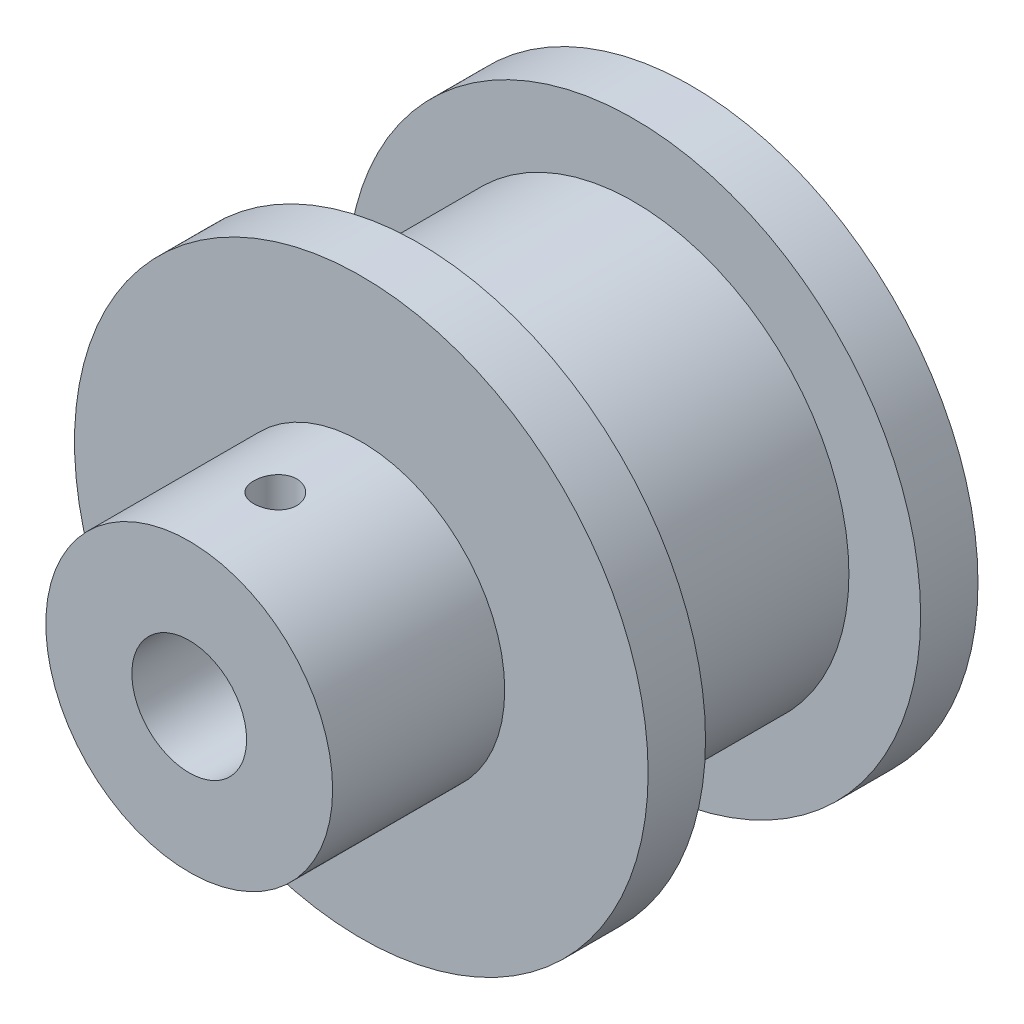
ISO-10303-21;
HEADER;
FILE_DESCRIPTION(('STEP AP214'),'2;1');
FILE_NAME('part.step','',(''),(''),'','','');
FILE_SCHEMA(('AUTOMOTIVE_DESIGN { 1 0 10303 214 1 1 1 1 }'));
ENDSEC;
DATA;
#1=APPLICATION_CONTEXT('core data for automotive mechanical design processes');
#2=APPLICATION_PROTOCOL_DEFINITION('international standard','automotive_design',2000,#1);
#3=PRODUCT_CONTEXT('',#1,'mechanical');
#4=PRODUCT('Part','Part','',(#3));
#5=PRODUCT_RELATED_PRODUCT_CATEGORY('part','',(#4));
#6=PRODUCT_DEFINITION_FORMATION('','',#4);
#7=PRODUCT_DEFINITION_CONTEXT('part definition',#1,'design');
#8=PRODUCT_DEFINITION('design','',#6,#7);
#9=PRODUCT_DEFINITION_SHAPE('','',#8);
#10=(LENGTH_UNIT() NAMED_UNIT(*) SI_UNIT(.MILLI.,.METRE.));
#11=(NAMED_UNIT(*) PLANE_ANGLE_UNIT() SI_UNIT($,.RADIAN.));
#12=(NAMED_UNIT(*) SI_UNIT($,.STERADIAN.) SOLID_ANGLE_UNIT());
#13=UNCERTAINTY_MEASURE_WITH_UNIT(LENGTH_MEASURE(1.E-05),#10,'distance_accuracy_value','');
#14=(GEOMETRIC_REPRESENTATION_CONTEXT(3) GLOBAL_UNCERTAINTY_ASSIGNED_CONTEXT((#13)) GLOBAL_UNIT_ASSIGNED_CONTEXT((#10,
#11,#12)) REPRESENTATION_CONTEXT('',''));
#15=CARTESIAN_POINT('',(0.,0.,0.));
#16=DIRECTION('',(0.,0.,1.));
#17=DIRECTION('',(1.,0.,0.));
#18=AXIS2_PLACEMENT_3D('',#15,#16,#17);
#19=CARTESIAN_POINT('',(0.,0.,31.));
#20=DIRECTION('',(0.,0.,-1.));
#21=DIRECTION('',(-1.,0.,0.));
#22=AXIS2_PLACEMENT_3D('',#19,#20,#21);
#23=CYLINDRICAL_SURFACE('',#22,4.);
#24=CARTESIAN_POINT('',(0.,0.,31.));
#25=DIRECTION('',(0.,0.,1.));
#26=DIRECTION('',(1.,0.,0.));
#27=AXIS2_PLACEMENT_3D('',#24,#25,#26);
#28=CIRCLE('',#27,4.);
#29=CARTESIAN_POINT('',(4.,0.,31.));
#30=VERTEX_POINT('',#29);
#31=EDGE_CURVE('E87',#30,#30,#28,.T.);
#32=ORIENTED_EDGE('',*,*,#31,.T.);
#33=EDGE_LOOP('',(#32));
#34=FACE_BOUND('',#33,.T.);
#35=CARTESIAN_POINT('',(0.,4.,23.5));
#36=CARTESIAN_POINT('',(-0.0812350589378528,4.00000217456151,23.4999970976969));
#37=CARTESIAN_POINT('',(-0.162450241781792,3.99750379283184,23.5066197602484));
#38=CARTESIAN_POINT('',(-0.322453452352361,3.98778696006928,23.5328281952699));
#39=CARTESIAN_POINT('',(-0.401241827987616,3.98056918893993,23.5524121004706));
#40=CARTESIAN_POINT('',(-0.554060784990879,3.96218832391545,23.6037530017718));
#41=CARTESIAN_POINT('',(-0.628100224162278,3.9510328434944,23.6354865168218));
#42=CARTESIAN_POINT('',(-0.769799310160254,3.92588767765353,23.7101064130158));
#43=CARTESIAN_POINT('',(-0.83745723917788,3.91189723227548,23.7529957855442));
#44=CARTESIAN_POINT('',(-0.967346417045826,3.88186246971217,23.8506125310709));
#45=CARTESIAN_POINT('',(-1.02927073015119,3.86576002583566,23.9057302622594));
#46=CARTESIAN_POINT('',(-1.14324421474363,3.83360220871327,24.0254104346588));
#47=CARTESIAN_POINT('',(-1.19529036359203,3.81754685135033,24.0899757560879));
#48=CARTESIAN_POINT('',(-1.28998202215985,3.78662470617731,24.2297174675232));
#49=CARTESIAN_POINT('',(-1.3321939319576,3.77182648820818,24.3052043665458));
#50=CARTESIAN_POINT('',(-1.40318646334084,3.74599860237433,24.4628483541685));
#51=CARTESIAN_POINT('',(-1.43197244961239,3.73496742975881,24.5450027631551));
#52=CARTESIAN_POINT('',(-1.47408431017549,3.71854412824136,24.7101167402582));
#53=CARTESIAN_POINT('',(-1.48799593218558,3.71293924350838,24.7929050384354));
#54=CARTESIAN_POINT('',(-1.50179556531648,3.70738061461215,24.9598161579938));
#55=CARTESIAN_POINT('',(-1.50168936802631,3.70742453659305,25.0439384138745));
#56=CARTESIAN_POINT('',(-1.48790429610018,3.71297511632055,25.205769525213));
#57=CARTESIAN_POINT('',(-1.47503808509003,3.71815468871122,25.2835609060442));
#58=CARTESIAN_POINT('',(-1.4374416786833,3.7328493805953,25.4357871504053));
#59=CARTESIAN_POINT('',(-1.41270969663258,3.74236515298863,25.5102215066139));
#60=CARTESIAN_POINT('',(-1.35163748571904,3.76485702190253,25.6552770677282));
#61=CARTESIAN_POINT('',(-1.31508648737101,3.77789517988166,25.7257994861213));
#62=CARTESIAN_POINT('',(-1.23156073762698,3.80594210139319,25.859945737591));
#63=CARTESIAN_POINT('',(-1.18458238728897,3.82095154457158,25.9235671775197));
#64=CARTESIAN_POINT('',(-1.07781780766549,3.85248038859113,26.0466036636509));
#65=CARTESIAN_POINT('',(-1.01738298716956,3.86903347455671,26.1054486407481));
#66=CARTESIAN_POINT('',(-0.887312590819022,3.90091728164085,26.2123379662058));
#67=CARTESIAN_POINT('',(-0.817675603497365,3.91624781465952,26.2603806546057));
#68=CARTESIAN_POINT('',(-0.669723436992419,3.9442639480908,26.3449303970625));
#69=CARTESIAN_POINT('',(-0.591290713844718,3.95690498259616,26.3812475812211));
#70=CARTESIAN_POINT('',(-0.428836850524582,3.97778718326962,26.43998260427));
#71=CARTESIAN_POINT('',(-0.344818210845767,3.98603030341493,26.4624066165611));
#72=CARTESIAN_POINT('',(-0.178375243148665,3.99684443228065,26.4916227875419));
#73=CARTESIAN_POINT('',(-0.0961036195622087,3.99969369025686,26.4991826063825));
#74=CARTESIAN_POINT('',(0.0685724752550249,4.00025893700126,26.5006910638999));
#75=CARTESIAN_POINT('',(0.150976912983374,3.99797606386863,26.4946427203168));
#76=CARTESIAN_POINT('',(0.31026204856186,3.98871709772643,26.4696899576913));
#77=CARTESIAN_POINT('',(0.387233328007337,3.98192470962305,26.4512884562629));
#78=CARTESIAN_POINT('',(0.536941754957222,3.96451477091717,26.4028139274527));
#79=CARTESIAN_POINT('',(0.609678350347535,3.9538967228203,26.372739382052));
#80=CARTESIAN_POINT('',(0.751247765110156,3.92949624407681,26.3008135875605));
#81=CARTESIAN_POINT('',(0.819903083557796,3.91563000209348,26.2586422707766));
#82=CARTESIAN_POINT('',(0.949392711726626,3.88626671564664,26.1640818968284));
#83=CARTESIAN_POINT('',(1.01022412027045,3.87076907009516,26.1116890674548));
#84=CARTESIAN_POINT('',(1.12603079874454,3.83873329490989,25.9945958778757));
#85=CARTESIAN_POINT('',(1.18046154123569,3.82218696503729,25.9293578172273));
#86=CARTESIAN_POINT('',(1.27771050031903,3.79078815746854,25.7903486152923));
#87=CARTESIAN_POINT('',(1.32052767414519,3.77593583194399,25.7165767086115));
#88=CARTESIAN_POINT('',(1.39337773518998,3.74966829822463,25.5619840132277));
#89=CARTESIAN_POINT('',(1.42335685446918,3.73826760328493,25.4811352540896));
#90=CARTESIAN_POINT('',(1.46907883466889,3.72054032891005,25.3149902363122));
#91=CARTESIAN_POINT('',(1.48483050305535,3.71421061057491,25.2296967638019));
#92=CARTESIAN_POINT('',(1.50086347097839,3.70775894792573,25.0629838404589));
#93=CARTESIAN_POINT('',(1.50207331495837,3.70726444523341,24.9816673682831));
#94=CARTESIAN_POINT('',(1.49136715641593,3.71158412745292,24.8200546837238));
#95=CARTESIAN_POINT('',(1.47945239850124,3.71639780898899,24.7397583753284));
#96=CARTESIAN_POINT('',(1.44355815630242,3.73048141585432,24.5849527732834));
#97=CARTESIAN_POINT('',(1.41995798316524,3.73961085376663,24.5103416537547));
#98=CARTESIAN_POINT('',(1.3616969677992,3.76121548297845,24.3660944915056));
#99=CARTESIAN_POINT('',(1.32703332944945,3.77369151995215,24.2964597119299));
#100=CARTESIAN_POINT('',(1.24552075938154,3.80139723903965,24.1601732103024));
#101=CARTESIAN_POINT('',(1.1981283280301,3.81673698440964,24.0938692032001));
#102=CARTESIAN_POINT('',(1.09334485729906,3.84806246757177,23.9698584390288));
#103=CARTESIAN_POINT('',(1.03595064012808,3.86404840943145,23.9121544252132));
#104=CARTESIAN_POINT('',(0.909080396784623,3.89590424609881,23.8037980441782));
#105=CARTESIAN_POINT('',(0.839118644212993,3.91172104900645,23.7536962465653));
#106=CARTESIAN_POINT('',(0.691213223200822,3.94054514457031,23.6659773447234));
#107=CARTESIAN_POINT('',(0.613268934090622,3.95355221851559,23.6283612122636));
#108=CARTESIAN_POINT('',(0.447999082002312,3.9757429260668,23.5656231709517));
#109=CARTESIAN_POINT('',(0.360413422234208,3.98473657158356,23.5411129353981));
#110=CARTESIAN_POINT('',(0.181875733606382,3.99686242179587,23.5083070400793));
#111=CARTESIAN_POINT('',(0.0909254163648589,3.99999756603967,23.5000032485127));
#112=CARTESIAN_POINT('',(0.,4.,23.5));
#113=B_SPLINE_CURVE_WITH_KNOTS('',3,(#35,#36,#37,#38,#39,#40,#41,#42,#43,#44,#45,#46,#47,#48,
#49,#50,#51,#52,#53,#54,#55,#56,#57,#58,#59,#60,#61,#62,#63,#64,#65,#66,#67,#68,#69,#70,#71,#72,
#73,#74,#75,#76,#77,#78,#79,#80,#81,#82,#83,#84,#85,#86,#87,#88,#89,#90,#91,#92,#93,#94,#95,#96,
#97,#98,#99,#100,#101,#102,#103,#104,#105,#106,#107,#108,#109,#110,#111,#112),.UNSPECIFIED.,.T.,
.F.,(4,2,2,2,2,2,2,2,2,2,2,2,2,2,2,2,2,2,2,2,2,2,2,2,2,2,2,2,2,2,2,2,2,2,2,2,2,2,4),(0.,
0.24336980156056,0.48670454953046,0.729571369213575,0.972503379609491,1.22473618582716,
1.47704604925622,1.73896674501658,2.00078269352134,2.25185874416902,2.50283106079707,
2.73878345119971,2.97477138060589,3.21522408387018,3.45575990744258,3.71246153335812,
3.96920257905066,4.22991375286075,4.49050899698846,4.73725019635925,4.98393668390521,
5.2211443792384,5.45838293254454,5.702592218596,5.94689180019868,6.20536519455658,
6.46386178920141,6.72343066727203,6.98283874956507,7.22558763480252,7.46831350211259,
7.70363142426534,7.93900886656507,8.18672471884272,8.43451941997062,8.69572329654039,
8.95694749805102,9.22948515032042,9.50188601796128),.UNSPECIFIED.);
#114=CARTESIAN_POINT('',(0.,4.,23.5));
#115=VERTEX_POINT('',#114);
#116=EDGE_CURVE('E70',#115,#115,#113,.T.);
#117=ORIENTED_EDGE('',*,*,#116,.T.);
#118=EDGE_LOOP('',(#117));
#119=FACE_BOUND('',#118,.T.);
#120=CARTESIAN_POINT('',(0.,0.,-4.));
#121=DIRECTION('',(0.,0.,1.));
#122=DIRECTION('',(1.,0.,0.));
#123=AXIS2_PLACEMENT_3D('',#120,#121,#122);
#124=CIRCLE('',#123,4.);
#125=CARTESIAN_POINT('',(4.,0.,-4.));
#126=VERTEX_POINT('',#125);
#127=EDGE_CURVE('E48',#126,#126,#124,.T.);
#128=ORIENTED_EDGE('',*,*,#127,.F.);
#129=EDGE_LOOP('',(#128));
#130=FACE_BOUND('',#129,.T.);
#131=ADVANCED_FACE('F44',(#34,#119,#130),#23,.F.);
#132=CARTESIAN_POINT('',(0.,0.,31.));
#133=DIRECTION('',(0.,0.,-1.));
#134=DIRECTION('',(-1.,0.,0.));
#135=AXIS2_PLACEMENT_3D('',#132,#133,#134);
#136=CYLINDRICAL_SURFACE('',#135,10.);
#137=CARTESIAN_POINT('',(0.,0.,31.));
#138=DIRECTION('',(0.,0.,1.));
#139=DIRECTION('',(1.,0.,0.));
#140=AXIS2_PLACEMENT_3D('',#137,#138,#139);
#141=CIRCLE('',#140,10.);
#142=CARTESIAN_POINT('',(10.,0.,31.));
#143=VERTEX_POINT('',#142);
#144=EDGE_CURVE('E133',#143,#143,#141,.T.);
#145=ORIENTED_EDGE('',*,*,#144,.F.);
#146=EDGE_LOOP('',(#145));
#147=FACE_BOUND('',#146,.T.);
#148=CARTESIAN_POINT('',(0.,0.,19.));
#149=DIRECTION('',(0.,0.,1.));
#150=DIRECTION('',(1.,0.,0.));
#151=AXIS2_PLACEMENT_3D('',#148,#149,#150);
#152=CIRCLE('',#151,10.);
#153=CARTESIAN_POINT('',(10.,0.,19.));
#154=VERTEX_POINT('',#153);
#155=EDGE_CURVE('E86',#154,#154,#152,.T.);
#156=ORIENTED_EDGE('',*,*,#155,.T.);
#157=EDGE_LOOP('',(#156));
#158=FACE_BOUND('',#157,.T.);
#159=CARTESIAN_POINT('',(0.,10.,23.5));
#160=CARTESIAN_POINT('',(-0.083751544481642,9.99999865771297,23.5000034538152));
#161=CARTESIAN_POINT('',(-0.167551685082132,9.9989368253704,23.5070380008406));
#162=CARTESIAN_POINT('',(-0.332809627994913,9.99480315973187,23.5349831999828));
#163=CARTESIAN_POINT('',(-0.414265068974229,9.99172936938473,23.5559073629449));
#164=CARTESIAN_POINT('',(-0.57241808622186,9.98391721219526,23.6109925049676));
#165=CARTESIAN_POINT('',(-0.649119207826799,9.97918010370919,23.645143479506));
#166=CARTESIAN_POINT('',(-0.795690428635254,9.96856475911724,23.7256883794169));
#167=CARTESIAN_POINT('',(-0.865561474725189,9.96268668152773,23.7720806044174));
#168=CARTESIAN_POINT('',(-0.997046719562127,9.95039170991452,23.8761772649399));
#169=CARTESIAN_POINT('',(-1.0585998322255,9.94397133890331,23.9339584562082));
#170=CARTESIAN_POINT('',(-1.17117490668949,9.93134261133238,24.0590276888939));
#171=CARTESIAN_POINT('',(-1.22219626272936,9.92513426698505,24.1263162767785));
#172=CARTESIAN_POINT('',(-1.31249729499943,9.91359877458726,24.2689006435225));
#173=CARTESIAN_POINT('',(-1.35171787037205,9.90827611975031,24.3442342469813));
#174=CARTESIAN_POINT('',(-1.41692632171056,9.89916211306268,24.5005128206454));
#175=CARTESIAN_POINT('',(-1.44291491889163,9.89537067775448,24.5814574847439));
#176=CARTESIAN_POINT('',(-1.48073198798911,9.88978256218673,24.7460180418717));
#177=CARTESIAN_POINT('',(-1.49266503640518,9.8879711574125,24.829609393408));
#178=CARTESIAN_POINT('',(-1.50235624033932,9.88650348970582,24.9976261659873));
#179=CARTESIAN_POINT('',(-1.50011520973796,9.88684710303147,25.0820515388625));
#180=CARTESIAN_POINT('',(-1.48160733250788,9.88963718352409,25.2486010801941));
#181=CARTESIAN_POINT('',(-1.4654569592775,9.89206618761549,25.3307385264848));
#182=CARTESIAN_POINT('',(-1.41977117403734,9.89872608126367,25.4911243688715));
#183=CARTESIAN_POINT('',(-1.39023538337812,9.90295702179379,25.5693726548807));
#184=CARTESIAN_POINT('',(-1.31849603529737,9.91276335545481,25.7201133712829));
#185=CARTESIAN_POINT('',(-1.27624314283198,9.91834396766526,25.7925819690924));
#186=CARTESIAN_POINT('',(-1.18030413128955,9.93021707574548,25.9294445957819));
#187=CARTESIAN_POINT('',(-1.12661726182478,9.93650961832501,25.9938380942694));
#188=CARTESIAN_POINT('',(-1.00869493078248,9.94917473056209,26.1133976607397));
#189=CARTESIAN_POINT('',(-0.944359329642001,9.95554747112815,26.1684649902863));
#190=CARTESIAN_POINT('',(-0.807307089894185,9.96759647648462,26.2670359345073));
#191=CARTESIAN_POINT('',(-0.73459041458817,9.9732727382251,26.3105394985439));
#192=CARTESIAN_POINT('',(-0.582754598213686,9.98329515585393,26.3847530864995));
#193=CARTESIAN_POINT('',(-0.503631677836781,9.98764051925428,26.4154554918403));
#194=CARTESIAN_POINT('',(-0.341273182487062,9.99450490557069,26.4631093896854));
#195=CARTESIAN_POINT('',(-0.258037885952601,9.99702405195467,26.4800618118156));
#196=CARTESIAN_POINT('',(-0.090669567643647,9.99993581133871,26.4996032298167));
#197=CARTESIAN_POINT('',(-0.00655273187047094,10.0003485209039,26.5023279713793));
#198=CARTESIAN_POINT('',(0.160936677662282,9.99905561015226,26.493696994689));
#199=CARTESIAN_POINT('',(0.244309274381876,9.99735005541368,26.4823417123319));
#200=CARTESIAN_POINT('',(0.407532387431407,9.99202468615333,26.4459858998225));
#201=CARTESIAN_POINT('',(0.487397963079837,9.98841415207984,26.4210515039692));
#202=CARTESIAN_POINT('',(0.641814958642998,9.97968235658369,26.3583150025382));
#203=CARTESIAN_POINT('',(0.716366128795099,9.97456102421565,26.3205122926664));
#204=CARTESIAN_POINT('',(0.85863497929192,9.96332682468686,26.2327937754361));
#205=CARTESIAN_POINT('',(0.926299009891566,9.95720701626745,26.1827918599872));
#206=CARTESIAN_POINT('',(1.05232367317771,9.94467863012165,26.0722141883713));
#207=CARTESIAN_POINT('',(1.1106837647934,9.93827003562867,26.0116378176754));
#208=CARTESIAN_POINT('',(1.21693784957195,9.92582264304494,25.8810264668235));
#209=CARTESIAN_POINT('',(1.26474084747421,9.91978736017588,25.8109170748052));
#210=CARTESIAN_POINT('',(1.34789129270584,9.90883219104903,25.6635839594882));
#211=CARTESIAN_POINT('',(1.38323907656436,9.90391227465628,25.5863604284785));
#212=CARTESIAN_POINT('',(1.44033467323943,9.89577033008645,25.4272624663769));
#213=CARTESIAN_POINT('',(1.46213037141635,9.89254233006438,25.3454055390288));
#214=CARTESIAN_POINT('',(1.49165549501586,9.88813382297802,25.1791409845649));
#215=CARTESIAN_POINT('',(1.49938589183067,9.88695317451771,25.0947335340053));
#216=CARTESIAN_POINT('',(1.5005378666944,9.88677832610841,24.9266709366842));
#217=CARTESIAN_POINT('',(1.49410252167313,9.88776226333502,24.8430167582431));
#218=CARTESIAN_POINT('',(1.46741229544379,9.89175820611174,24.6779947366765));
#219=CARTESIAN_POINT('',(1.44715743638627,9.89477020841118,24.5966268898866));
#220=CARTESIAN_POINT('',(1.39345373518665,9.90247526112297,24.4385269177657));
#221=CARTESIAN_POINT('',(1.36001489324314,9.90716703716075,24.3617913295666));
#222=CARTESIAN_POINT('',(1.28090667642309,9.91770454557702,24.2149963661976));
#223=CARTESIAN_POINT('',(1.23523688741502,9.92355031702724,24.1449372171964));
#224=CARTESIAN_POINT('',(1.13244337659164,9.93580743364938,24.0127569420248));
#225=CARTESIAN_POINT('',(1.07521369039806,9.94222367881967,23.9507186667529));
#226=CARTESIAN_POINT('',(0.951148841082838,9.95485788826636,23.8370754452122));
#227=CARTESIAN_POINT('',(0.884311448350945,9.96107580610759,23.7854729274238));
#228=CARTESIAN_POINT('',(0.742495707543725,9.9726518579052,23.6939123233926));
#229=CARTESIAN_POINT('',(0.667474576764763,9.9780050712882,23.6540198907853));
#230=CARTESIAN_POINT('',(0.511751870248721,9.98720028802959,23.587461483242));
#231=CARTESIAN_POINT('',(0.431056277096705,9.99104385565757,23.5607818099463));
#232=CARTESIAN_POINT('',(0.291665727889329,9.99590939261505,23.5274586572899));
#233=CARTESIAN_POINT('',(0.233831133495278,9.99743549179557,23.5171773984612));
#234=CARTESIAN_POINT('',(0.117338971600125,9.99948125947896,23.5034469022874));
#235=CARTESIAN_POINT('',(0.0586814143344171,10.0000009404877,23.4999975800475));
#236=CARTESIAN_POINT('',(0.,10.,23.5));
#237=B_SPLINE_CURVE_WITH_KNOTS('',3,(#159,#160,#161,#162,#163,#164,#165,#166,#167,#168,#169,
#170,#171,#172,#173,#174,#175,#176,#177,#178,#179,#180,#181,#182,#183,#184,#185,#186,#187,#188,
#189,#190,#191,#192,#193,#194,#195,#196,#197,#198,#199,#200,#201,#202,#203,#204,#205,#206,#207,
#208,#209,#210,#211,#212,#213,#214,#215,#216,#217,#218,#219,#220,#221,#222,#223,#224,#225,#226,
#227,#228,#229,#230,#231,#232,#233,#234,#235,#236),.UNSPECIFIED.,.T.,.F.,(4,2,2,2,2,2,2,2,2,2,2,
2,2,2,2,2,2,2,2,2,2,2,2,2,2,2,2,2,2,2,2,2,2,2,2,2,2,2,4),(0.,0.251040205031663,0.50232496292915,
0.753420023583239,1.0044802241976,1.25729416136843,1.5101226357258,1.76419702395375,
2.01825756225506,2.27041564605925,2.52255925098983,2.77261177195746,3.02267136690361,
3.27371383476159,3.52477278308534,3.77834291255409,4.03191415238668,4.28563608984874,
4.53934087193401,4.79062058544255,5.04189251991155,5.29195148965948,5.54202220376273,
5.79391188036908,6.04581620028629,6.29981366584671,6.55380426808832,6.80689223457168,
7.05996272137177,7.31048888261064,7.56101464229564,7.81135073984147,8.06169531466879,
8.3144482996572,8.56726003468733,8.82146323384733,9.07540233261441,9.25129851978808,
9.42719252123291),.UNSPECIFIED.);
#238=CARTESIAN_POINT('',(0.,10.,23.5));
#239=VERTEX_POINT('',#238);
#240=EDGE_CURVE('E64',#239,#239,#237,.T.);
#241=ORIENTED_EDGE('',*,*,#240,.F.);
#242=EDGE_LOOP('',(#241));
#243=FACE_BOUND('',#242,.T.);
#244=ADVANCED_FACE('F71',(#147,#158,#243),#136,.T.);
#245=CARTESIAN_POINT('',(0.,0.,-4.));
#246=DIRECTION('',(0.,0.,1.));
#247=DIRECTION('',(1.,0.,0.));
#248=AXIS2_PLACEMENT_3D('',#245,#246,#247);
#249=CYLINDRICAL_SURFACE('',#248,20.);
#250=CARTESIAN_POINT('',(0.,0.,-4.));
#251=DIRECTION('',(0.,0.,1.));
#252=DIRECTION('',(1.,0.,0.));
#253=AXIS2_PLACEMENT_3D('',#250,#251,#252);
#254=CIRCLE('',#253,20.);
#255=CARTESIAN_POINT('',(20.,0.,-4.));
#256=VERTEX_POINT('',#255);
#257=EDGE_CURVE('E52',#256,#256,#254,.T.);
#258=ORIENTED_EDGE('',*,*,#257,.T.);
#259=EDGE_LOOP('',(#258));
#260=FACE_BOUND('',#259,.T.);
#261=CARTESIAN_POINT('',(0.,0.,0.));
#262=DIRECTION('',(0.,0.,1.));
#263=DIRECTION('',(1.,0.,0.));
#264=AXIS2_PLACEMENT_3D('',#261,#262,#263);
#265=CIRCLE('',#264,20.);
#266=CARTESIAN_POINT('',(20.,0.,0.));
#267=VERTEX_POINT('',#266);
#268=EDGE_CURVE('E57',#267,#267,#265,.T.);
#269=ORIENTED_EDGE('',*,*,#268,.F.);
#270=EDGE_LOOP('',(#269));
#271=FACE_BOUND('',#270,.T.);
#272=ADVANCED_FACE('F46',(#260,#271),#249,.T.);
#273=CARTESIAN_POINT('',(0.,0.,-4.));
#274=DIRECTION('',(0.,0.,1.));
#275=DIRECTION('',(1.,0.,0.));
#276=AXIS2_PLACEMENT_3D('',#273,#274,#275);
#277=PLANE('',#276);
#278=ORIENTED_EDGE('',*,*,#127,.T.);
#279=EDGE_LOOP('',(#278));
#280=FACE_BOUND('',#279,.T.);
#281=ORIENTED_EDGE('',*,*,#257,.F.);
#282=EDGE_LOOP('',(#281));
#283=FACE_BOUND('',#282,.T.);
#284=ADVANCED_FACE('F110',(#280,#283),#277,.F.);
#285=CARTESIAN_POINT('',(0.,0.,0.));
#286=DIRECTION('',(0.,0.,1.));
#287=DIRECTION('',(1.,0.,0.));
#288=AXIS2_PLACEMENT_3D('',#285,#286,#287);
#289=PLANE('',#288);
#290=CARTESIAN_POINT('',(0.,0.,0.));
#291=DIRECTION('',(0.,0.,1.));
#292=DIRECTION('',(1.,0.,0.));
#293=AXIS2_PLACEMENT_3D('',#290,#291,#292);
#294=CIRCLE('',#293,15.);
#295=CARTESIAN_POINT('',(15.,0.,0.));
#296=VERTEX_POINT('',#295);
#297=EDGE_CURVE('E12',#296,#296,#294,.T.);
#298=ORIENTED_EDGE('',*,*,#297,.F.);
#299=EDGE_LOOP('',(#298));
#300=FACE_BOUND('',#299,.T.);
#301=ORIENTED_EDGE('',*,*,#268,.T.);
#302=EDGE_LOOP('',(#301));
#303=FACE_BOUND('',#302,.T.);
#304=ADVANCED_FACE('F108',(#300,#303),#289,.T.);
#305=CARTESIAN_POINT('',(0.,0.,15.));
#306=DIRECTION('',(0.,0.,-1.));
#307=DIRECTION('',(-1.,0.,0.));
#308=AXIS2_PLACEMENT_3D('',#305,#306,#307);
#309=CYLINDRICAL_SURFACE('',#308,15.);
#310=CARTESIAN_POINT('',(0.,0.,15.));
#311=DIRECTION('',(0.,0.,1.));
#312=DIRECTION('',(1.,0.,0.));
#313=AXIS2_PLACEMENT_3D('',#310,#311,#312);
#314=CIRCLE('',#313,15.);
#315=CARTESIAN_POINT('',(15.,0.,15.));
#316=VERTEX_POINT('',#315);
#317=EDGE_CURVE('E60',#316,#316,#314,.T.);
#318=ORIENTED_EDGE('',*,*,#317,.F.);
#319=EDGE_LOOP('',(#318));
#320=FACE_BOUND('',#319,.T.);
#321=ORIENTED_EDGE('',*,*,#297,.T.);
#322=EDGE_LOOP('',(#321));
#323=FACE_BOUND('',#322,.T.);
#324=ADVANCED_FACE('F104',(#320,#323),#309,.T.);
#325=CARTESIAN_POINT('',(0.,0.,19.));
#326=DIRECTION('',(0.,0.,-1.));
#327=DIRECTION('',(-1.,0.,0.));
#328=AXIS2_PLACEMENT_3D('',#325,#326,#327);
#329=CYLINDRICAL_SURFACE('',#328,20.);
#330=CARTESIAN_POINT('',(0.,0.,19.));
#331=DIRECTION('',(0.,0.,1.));
#332=DIRECTION('',(1.,0.,0.));
#333=AXIS2_PLACEMENT_3D('',#330,#331,#332);
#334=CIRCLE('',#333,20.);
#335=CARTESIAN_POINT('',(20.,0.,19.));
#336=VERTEX_POINT('',#335);
#337=EDGE_CURVE('E142',#336,#336,#334,.T.);
#338=ORIENTED_EDGE('',*,*,#337,.F.);
#339=EDGE_LOOP('',(#338));
#340=FACE_BOUND('',#339,.T.);
#341=CARTESIAN_POINT('',(0.,0.,15.));
#342=DIRECTION('',(0.,0.,1.));
#343=DIRECTION('',(1.,0.,0.));
#344=AXIS2_PLACEMENT_3D('',#341,#342,#343);
#345=CIRCLE('',#344,20.);
#346=CARTESIAN_POINT('',(20.,0.,15.));
#347=VERTEX_POINT('',#346);
#348=EDGE_CURVE('E144',#347,#347,#345,.T.);
#349=ORIENTED_EDGE('',*,*,#348,.T.);
#350=EDGE_LOOP('',(#349));
#351=FACE_BOUND('',#350,.T.);
#352=ADVANCED_FACE('F97',(#340,#351),#329,.T.);
#353=CARTESIAN_POINT('',(0.,0.,19.));
#354=DIRECTION('',(0.,0.,1.));
#355=DIRECTION('',(1.,0.,0.));
#356=AXIS2_PLACEMENT_3D('',#353,#354,#355);
#357=PLANE('',#356);
#358=ORIENTED_EDGE('',*,*,#155,.F.);
#359=EDGE_LOOP('',(#358));
#360=FACE_BOUND('',#359,.T.);
#361=ORIENTED_EDGE('',*,*,#337,.T.);
#362=EDGE_LOOP('',(#361));
#363=FACE_BOUND('',#362,.T.);
#364=ADVANCED_FACE('F93',(#360,#363),#357,.T.);
#365=CARTESIAN_POINT('',(0.,0.,15.));
#366=DIRECTION('',(0.,0.,1.));
#367=DIRECTION('',(1.,0.,0.));
#368=AXIS2_PLACEMENT_3D('',#365,#366,#367);
#369=PLANE('',#368);
#370=ORIENTED_EDGE('',*,*,#317,.T.);
#371=EDGE_LOOP('',(#370));
#372=FACE_BOUND('',#371,.T.);
#373=ORIENTED_EDGE('',*,*,#348,.F.);
#374=EDGE_LOOP('',(#373));
#375=FACE_BOUND('',#374,.T.);
#376=ADVANCED_FACE('F96',(#372,#375),#369,.F.);
#377=CARTESIAN_POINT('',(0.,0.,31.));
#378=DIRECTION('',(0.,0.,1.));
#379=DIRECTION('',(1.,0.,0.));
#380=AXIS2_PLACEMENT_3D('',#377,#378,#379);
#381=PLANE('',#380);
#382=ORIENTED_EDGE('',*,*,#31,.F.);
#383=EDGE_LOOP('',(#382));
#384=FACE_BOUND('',#383,.T.);
#385=ORIENTED_EDGE('',*,*,#144,.T.);
#386=EDGE_LOOP('',(#385));
#387=FACE_BOUND('',#386,.T.);
#388=ADVANCED_FACE('F78',(#384,#387),#381,.T.);
#389=CARTESIAN_POINT('',(0.,18.,25.));
#390=DIRECTION('',(0.,-1.,0.));
#391=DIRECTION('',(0.,0.,-1.));
#392=AXIS2_PLACEMENT_3D('',#389,#390,#391);
#393=CYLINDRICAL_SURFACE('',#392,1.5);
#394=ORIENTED_EDGE('',*,*,#116,.F.);
#395=EDGE_LOOP('',(#394));
#396=FACE_BOUND('',#395,.T.);
#397=ORIENTED_EDGE('',*,*,#240,.T.);
#398=EDGE_LOOP('',(#397));
#399=FACE_BOUND('',#398,.T.);
#400=ADVANCED_FACE('F75',(#396,#399),#393,.F.);
#401=CLOSED_SHELL('',(#131,#244,#272,#284,#304,#324,#352,#364,#376,#388,#400));
#402=MANIFOLD_SOLID_BREP('B2',#401);
#403=ADVANCED_BREP_SHAPE_REPRESENTATION('',(#18,#402),#14);
#404=SHAPE_DEFINITION_REPRESENTATION(#9,#403);
ENDSEC;
END-ISO-10303-21;
